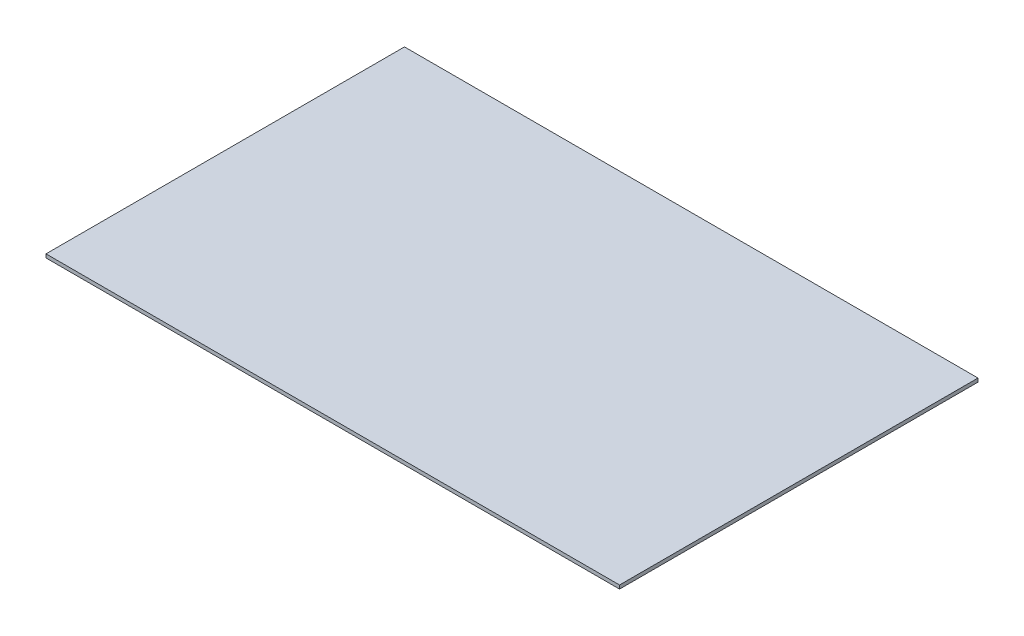
ISO-10303-21;
HEADER;
FILE_DESCRIPTION(('STEP AP214'),'2;1');
FILE_NAME('part.step','',(''),(''),'','','');
FILE_SCHEMA(('AUTOMOTIVE_DESIGN { 1 0 10303 214 1 1 1 1 }'));
ENDSEC;
DATA;
#1=APPLICATION_CONTEXT('core data for automotive mechanical design processes');
#2=APPLICATION_PROTOCOL_DEFINITION('international standard','automotive_design',2000,#1);
#3=PRODUCT_CONTEXT('',#1,'mechanical');
#4=PRODUCT('Part','Part','',(#3));
#5=PRODUCT_RELATED_PRODUCT_CATEGORY('part','',(#4));
#6=PRODUCT_DEFINITION_FORMATION('','',#4);
#7=PRODUCT_DEFINITION_CONTEXT('part definition',#1,'design');
#8=PRODUCT_DEFINITION('design','',#6,#7);
#9=PRODUCT_DEFINITION_SHAPE('','',#8);
#10=(LENGTH_UNIT() NAMED_UNIT(*) SI_UNIT(.MILLI.,.METRE.));
#11=(NAMED_UNIT(*) PLANE_ANGLE_UNIT() SI_UNIT($,.RADIAN.));
#12=(NAMED_UNIT(*) SI_UNIT($,.STERADIAN.) SOLID_ANGLE_UNIT());
#13=UNCERTAINTY_MEASURE_WITH_UNIT(LENGTH_MEASURE(1.E-05),#10,'distance_accuracy_value','');
#14=(GEOMETRIC_REPRESENTATION_CONTEXT(3) GLOBAL_UNCERTAINTY_ASSIGNED_CONTEXT((#13)) GLOBAL_UNIT_ASSIGNED_CONTEXT((#10,
#11,#12)) REPRESENTATION_CONTEXT('',''));
#15=CARTESIAN_POINT('',(0.,0.,0.));
#16=DIRECTION('',(0.,0.,1.));
#17=DIRECTION('',(1.,0.,0.));
#18=AXIS2_PLACEMENT_3D('',#15,#16,#17);
#19=CARTESIAN_POINT('',(400.,5.,250.));
#20=DIRECTION('',(-1.,0.,0.));
#21=DIRECTION('',(0.,0.,1.));
#22=AXIS2_PLACEMENT_3D('',#19,#20,#21);
#23=PLANE('',#22);
#24=DIRECTION('',(0.,0.,-1.));
#25=VECTOR('',#24,1.);
#26=CARTESIAN_POINT('',(400.,0.,250.));
#27=LINE('',#26,#25);
#28=CARTESIAN_POINT('',(400.,0.,250.));
#29=VERTEX_POINT('',#28);
#30=CARTESIAN_POINT('',(400.,0.,-250.));
#31=VERTEX_POINT('',#30);
#32=EDGE_CURVE('E112',#29,#31,#27,.T.);
#33=ORIENTED_EDGE('',*,*,#32,.T.);
#34=DIRECTION('',(0.,-1.,0.));
#35=VECTOR('',#34,1.);
#36=CARTESIAN_POINT('',(400.,5.,-250.));
#37=LINE('',#36,#35);
#38=CARTESIAN_POINT('',(400.,5.,-250.));
#39=VERTEX_POINT('',#38);
#40=EDGE_CURVE('E11',#39,#31,#37,.T.);
#41=ORIENTED_EDGE('',*,*,#40,.F.);
#42=DIRECTION('',(0.,0.,-1.));
#43=VECTOR('',#42,1.);
#44=CARTESIAN_POINT('',(400.,5.,250.));
#45=LINE('',#44,#43);
#46=CARTESIAN_POINT('',(400.,5.,250.));
#47=VERTEX_POINT('',#46);
#48=EDGE_CURVE('E95',#47,#39,#45,.T.);
#49=ORIENTED_EDGE('',*,*,#48,.F.);
#50=DIRECTION('',(0.,-1.,0.));
#51=VECTOR('',#50,1.);
#52=CARTESIAN_POINT('',(400.,5.,250.));
#53=LINE('',#52,#51);
#54=EDGE_CURVE('E108',#47,#29,#53,.T.);
#55=ORIENTED_EDGE('',*,*,#54,.T.);
#56=EDGE_LOOP('',(#33,#41,#49,#55));
#57=FACE_BOUND('',#56,.T.);
#58=ADVANCED_FACE('F43',(#57),#23,.F.);
#59=CARTESIAN_POINT('',(-400.,5.,-250.));
#60=DIRECTION('',(0.,0.,1.));
#61=DIRECTION('',(1.,0.,0.));
#62=AXIS2_PLACEMENT_3D('',#59,#60,#61);
#63=PLANE('',#62);
#64=DIRECTION('',(-1.,0.,0.));
#65=VECTOR('',#64,1.);
#66=CARTESIAN_POINT('',(-400.,0.,-250.));
#67=LINE('',#66,#65);
#68=CARTESIAN_POINT('',(-400.,0.,-250.));
#69=VERTEX_POINT('',#68);
#70=EDGE_CURVE('E100',#31,#69,#67,.T.);
#71=ORIENTED_EDGE('',*,*,#70,.T.);
#72=DIRECTION('',(0.,-1.,0.));
#73=VECTOR('',#72,1.);
#74=CARTESIAN_POINT('',(-400.,5.,-250.));
#75=LINE('',#74,#73);
#76=CARTESIAN_POINT('',(-400.,5.,-250.));
#77=VERTEX_POINT('',#76);
#78=EDGE_CURVE('E52',#77,#69,#75,.T.);
#79=ORIENTED_EDGE('',*,*,#78,.F.);
#80=DIRECTION('',(-1.,0.,0.));
#81=VECTOR('',#80,1.);
#82=CARTESIAN_POINT('',(-400.,5.,-250.));
#83=LINE('',#82,#81);
#84=EDGE_CURVE('E90',#39,#77,#83,.T.);
#85=ORIENTED_EDGE('',*,*,#84,.F.);
#86=ORIENTED_EDGE('',*,*,#40,.T.);
#87=EDGE_LOOP('',(#71,#79,#85,#86));
#88=FACE_BOUND('',#87,.T.);
#89=ADVANCED_FACE('F99',(#88),#63,.F.);
#90=CARTESIAN_POINT('',(-400.,5.,250.));
#91=DIRECTION('',(1.,0.,0.));
#92=DIRECTION('',(0.,0.,-1.));
#93=AXIS2_PLACEMENT_3D('',#90,#91,#92);
#94=PLANE('',#93);
#95=DIRECTION('',(0.,0.,1.));
#96=VECTOR('',#95,1.);
#97=CARTESIAN_POINT('',(-400.,0.,250.));
#98=LINE('',#97,#96);
#99=CARTESIAN_POINT('',(-400.,0.,250.));
#100=VERTEX_POINT('',#99);
#101=EDGE_CURVE('E77',#69,#100,#98,.T.);
#102=ORIENTED_EDGE('',*,*,#101,.T.);
#103=DIRECTION('',(0.,-1.,0.));
#104=VECTOR('',#103,1.);
#105=CARTESIAN_POINT('',(-400.,5.,250.));
#106=LINE('',#105,#104);
#107=CARTESIAN_POINT('',(-400.,5.,250.));
#108=VERTEX_POINT('',#107);
#109=EDGE_CURVE('E102',#108,#100,#106,.T.);
#110=ORIENTED_EDGE('',*,*,#109,.F.);
#111=DIRECTION('',(0.,0.,1.));
#112=VECTOR('',#111,1.);
#113=CARTESIAN_POINT('',(-400.,5.,250.));
#114=LINE('',#113,#112);
#115=EDGE_CURVE('E93',#77,#108,#114,.T.);
#116=ORIENTED_EDGE('',*,*,#115,.F.);
#117=ORIENTED_EDGE('',*,*,#78,.T.);
#118=EDGE_LOOP('',(#102,#110,#116,#117));
#119=FACE_BOUND('',#118,.T.);
#120=ADVANCED_FACE('F103',(#119),#94,.F.);
#121=CARTESIAN_POINT('',(-400.,5.,250.));
#122=DIRECTION('',(0.,0.,-1.));
#123=DIRECTION('',(-1.,0.,0.));
#124=AXIS2_PLACEMENT_3D('',#121,#122,#123);
#125=PLANE('',#124);
#126=DIRECTION('',(1.,0.,0.));
#127=VECTOR('',#126,1.);
#128=CARTESIAN_POINT('',(-400.,0.,250.));
#129=LINE('',#128,#127);
#130=EDGE_CURVE('E83',#100,#29,#129,.T.);
#131=ORIENTED_EDGE('',*,*,#130,.T.);
#132=ORIENTED_EDGE('',*,*,#54,.F.);
#133=DIRECTION('',(1.,0.,0.));
#134=VECTOR('',#133,1.);
#135=CARTESIAN_POINT('',(-400.,5.,250.));
#136=LINE('',#135,#134);
#137=EDGE_CURVE('E60',#108,#47,#136,.T.);
#138=ORIENTED_EDGE('',*,*,#137,.F.);
#139=ORIENTED_EDGE('',*,*,#109,.T.);
#140=EDGE_LOOP('',(#131,#132,#138,#139));
#141=FACE_BOUND('',#140,.T.);
#142=ADVANCED_FACE('F126',(#141),#125,.F.);
#143=CARTESIAN_POINT('',(0.,5.,0.));
#144=DIRECTION('',(0.,-1.,0.));
#145=DIRECTION('',(0.,0.,-1.));
#146=AXIS2_PLACEMENT_3D('',#143,#144,#145);
#147=PLANE('',#146);
#148=ORIENTED_EDGE('',*,*,#48,.T.);
#149=ORIENTED_EDGE('',*,*,#84,.T.);
#150=ORIENTED_EDGE('',*,*,#115,.T.);
#151=ORIENTED_EDGE('',*,*,#137,.T.);
#152=EDGE_LOOP('',(#148,#149,#150,#151));
#153=FACE_BOUND('',#152,.T.);
#154=ADVANCED_FACE('F91',(#153),#147,.F.);
#155=CARTESIAN_POINT('',(0.,0.,0.));
#156=DIRECTION('',(0.,-1.,0.));
#157=DIRECTION('',(0.,0.,-1.));
#158=AXIS2_PLACEMENT_3D('',#155,#156,#157);
#159=PLANE('',#158);
#160=ORIENTED_EDGE('',*,*,#32,.F.);
#161=ORIENTED_EDGE('',*,*,#130,.F.);
#162=ORIENTED_EDGE('',*,*,#101,.F.);
#163=ORIENTED_EDGE('',*,*,#70,.F.);
#164=EDGE_LOOP('',(#160,#161,#162,#163));
#165=FACE_BOUND('',#164,.T.);
#166=ADVANCED_FACE('F129',(#165),#159,.T.);
#167=CLOSED_SHELL('',(#58,#89,#120,#142,#154,#166));
#168=MANIFOLD_SOLID_BREP('B2',#167);
#169=ADVANCED_BREP_SHAPE_REPRESENTATION('',(#18,#168),#14);
#170=SHAPE_DEFINITION_REPRESENTATION(#9,#169);
ENDSEC;
END-ISO-10303-21;
